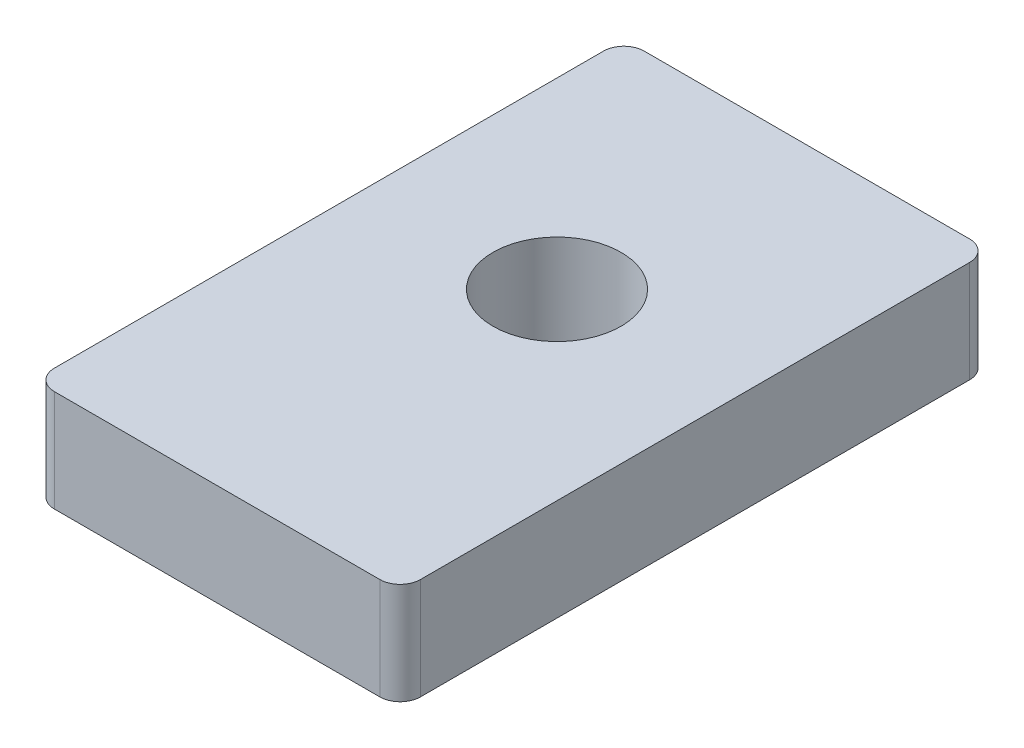
ISO-10303-21;
HEADER;
FILE_DESCRIPTION(('STEP AP214'),'2;1');
FILE_NAME('part.step','',(''),(''),'','','');
FILE_SCHEMA(('AUTOMOTIVE_DESIGN { 1 0 10303 214 1 1 1 1 }'));
ENDSEC;
DATA;
#1=APPLICATION_CONTEXT('core data for automotive mechanical design processes');
#2=APPLICATION_PROTOCOL_DEFINITION('international standard','automotive_design',2000,#1);
#3=PRODUCT_CONTEXT('',#1,'mechanical');
#4=PRODUCT('Part','Part','',(#3));
#5=PRODUCT_RELATED_PRODUCT_CATEGORY('part','',(#4));
#6=PRODUCT_DEFINITION_FORMATION('','',#4);
#7=PRODUCT_DEFINITION_CONTEXT('part definition',#1,'design');
#8=PRODUCT_DEFINITION('design','',#6,#7);
#9=PRODUCT_DEFINITION_SHAPE('','',#8);
#10=(LENGTH_UNIT() NAMED_UNIT(*) SI_UNIT(.MILLI.,.METRE.));
#11=(NAMED_UNIT(*) PLANE_ANGLE_UNIT() SI_UNIT($,.RADIAN.));
#12=(NAMED_UNIT(*) SI_UNIT($,.STERADIAN.) SOLID_ANGLE_UNIT());
#13=UNCERTAINTY_MEASURE_WITH_UNIT(LENGTH_MEASURE(1.E-05),#10,'distance_accuracy_value','');
#14=(GEOMETRIC_REPRESENTATION_CONTEXT(3) GLOBAL_UNCERTAINTY_ASSIGNED_CONTEXT((#13)) GLOBAL_UNIT_ASSIGNED_CONTEXT((#10,
#11,#12)) REPRESENTATION_CONTEXT('',''));
#15=CARTESIAN_POINT('',(0.,0.,0.));
#16=DIRECTION('',(0.,0.,1.));
#17=DIRECTION('',(1.,0.,0.));
#18=AXIS2_PLACEMENT_3D('',#15,#16,#17);
#19=CARTESIAN_POINT('',(0.,10.,58.));
#20=DIRECTION('',(1.,0.,0.));
#21=DIRECTION('',(0.,0.,-1.));
#22=AXIS2_PLACEMENT_3D('',#19,#20,#21);
#23=PLANE('',#22);
#24=DIRECTION('',(0.,0.,-1.));
#25=VECTOR('',#24,1.);
#26=CARTESIAN_POINT('',(0.,10.,58.));
#27=LINE('',#26,#25);
#28=CARTESIAN_POINT('',(0.,10.,56.));
#29=VERTEX_POINT('',#28);
#30=CARTESIAN_POINT('',(0.,10.,2.00000000000002));
#31=VERTEX_POINT('',#30);
#32=EDGE_CURVE('E160',#29,#31,#27,.T.);
#33=ORIENTED_EDGE('',*,*,#32,.T.);
#34=DIRECTION('',(0.,-1.,0.));
#35=VECTOR('',#34,1.);
#36=CARTESIAN_POINT('',(0.,10.,2.));
#37=LINE('',#36,#35);
#38=CARTESIAN_POINT('',(0.,0.,2.00000000000002));
#39=VERTEX_POINT('',#38);
#40=EDGE_CURVE('E124',#31,#39,#37,.T.);
#41=ORIENTED_EDGE('',*,*,#40,.T.);
#42=DIRECTION('',(0.,0.,-1.));
#43=VECTOR('',#42,1.);
#44=CARTESIAN_POINT('',(0.,0.,58.));
#45=LINE('',#44,#43);
#46=CARTESIAN_POINT('',(0.,0.,56.));
#47=VERTEX_POINT('',#46);
#48=EDGE_CURVE('E109',#47,#39,#45,.T.);
#49=ORIENTED_EDGE('',*,*,#48,.F.);
#50=DIRECTION('',(0.,-1.,0.));
#51=VECTOR('',#50,1.);
#52=CARTESIAN_POINT('',(0.,10.,56.));
#53=LINE('',#52,#51);
#54=EDGE_CURVE('E121',#47,#29,#53,.F.);
#55=ORIENTED_EDGE('',*,*,#54,.T.);
#56=EDGE_LOOP('',(#33,#41,#49,#55));
#57=FACE_BOUND('',#56,.T.);
#58=ADVANCED_FACE('F39',(#57),#23,.F.);
#59=CARTESIAN_POINT('',(0.,0.,58.));
#60=DIRECTION('',(0.,1.,0.));
#61=DIRECTION('',(0.,0.,1.));
#62=AXIS2_PLACEMENT_3D('',#59,#60,#61);
#63=PLANE('',#62);
#64=CARTESIAN_POINT('',(18.,0.,24.5744));
#65=DIRECTION('',(0.,1.,0.));
#66=DIRECTION('',(0.,0.,1.));
#67=AXIS2_PLACEMENT_3D('',#64,#65,#66);
#68=CIRCLE('',#67,6.3);
#69=CARTESIAN_POINT('',(18.,0.,30.8744));
#70=VERTEX_POINT('',#69);
#71=EDGE_CURVE('E171',#70,#70,#68,.T.);
#72=ORIENTED_EDGE('',*,*,#71,.T.);
#73=EDGE_LOOP('',(#72));
#74=FACE_BOUND('',#73,.T.);
#75=ORIENTED_EDGE('',*,*,#48,.T.);
#76=CARTESIAN_POINT('',(2.,0.,2.));
#77=DIRECTION('',(0.,1.,0.));
#78=DIRECTION('',(0.,0.,1.));
#79=AXIS2_PLACEMENT_3D('',#76,#77,#78);
#80=CIRCLE('',#79,2.);
#81=CARTESIAN_POINT('',(2.,0.,0.));
#82=VERTEX_POINT('',#81);
#83=EDGE_CURVE('E136',#39,#82,#80,.F.);
#84=ORIENTED_EDGE('',*,*,#83,.T.);
#85=DIRECTION('',(1.,0.,0.));
#86=VECTOR('',#85,1.);
#87=CARTESIAN_POINT('',(0.,0.,0.));
#88=LINE('',#87,#86);
#89=CARTESIAN_POINT('',(34.,0.,0.));
#90=VERTEX_POINT('',#89);
#91=EDGE_CURVE('E168',#82,#90,#88,.T.);
#92=ORIENTED_EDGE('',*,*,#91,.T.);
#93=CARTESIAN_POINT('',(34.,0.,2.));
#94=DIRECTION('',(0.,1.,0.));
#95=DIRECTION('',(0.,0.,1.));
#96=AXIS2_PLACEMENT_3D('',#93,#94,#95);
#97=CIRCLE('',#96,2.);
#98=CARTESIAN_POINT('',(36.,0.,2.00000000000002));
#99=VERTEX_POINT('',#98);
#100=EDGE_CURVE('E115',#90,#99,#97,.F.);
#101=ORIENTED_EDGE('',*,*,#100,.T.);
#102=DIRECTION('',(0.,0.,-1.));
#103=VECTOR('',#102,1.);
#104=CARTESIAN_POINT('',(36.,0.,58.));
#105=LINE('',#104,#103);
#106=CARTESIAN_POINT('',(36.,0.,56.));
#107=VERTEX_POINT('',#106);
#108=EDGE_CURVE('E125',#107,#99,#105,.T.);
#109=ORIENTED_EDGE('',*,*,#108,.F.);
#110=CARTESIAN_POINT('',(34.,0.,56.));
#111=DIRECTION('',(0.,1.,0.));
#112=DIRECTION('',(0.,0.,1.));
#113=AXIS2_PLACEMENT_3D('',#110,#111,#112);
#114=CIRCLE('',#113,2.);
#115=CARTESIAN_POINT('',(34.,0.,58.));
#116=VERTEX_POINT('',#115);
#117=EDGE_CURVE('E116',#107,#116,#114,.F.);
#118=ORIENTED_EDGE('',*,*,#117,.T.);
#119=DIRECTION('',(1.,0.,0.));
#120=VECTOR('',#119,1.);
#121=CARTESIAN_POINT('',(0.,0.,58.));
#122=LINE('',#121,#120);
#123=CARTESIAN_POINT('',(2.,0.,58.));
#124=VERTEX_POINT('',#123);
#125=EDGE_CURVE('E111',#124,#116,#122,.T.);
#126=ORIENTED_EDGE('',*,*,#125,.F.);
#127=CARTESIAN_POINT('',(2.,0.,56.));
#128=DIRECTION('',(0.,1.,0.));
#129=DIRECTION('',(0.,0.,1.));
#130=AXIS2_PLACEMENT_3D('',#127,#128,#129);
#131=CIRCLE('',#130,2.);
#132=EDGE_CURVE('E106',#124,#47,#131,.F.);
#133=ORIENTED_EDGE('',*,*,#132,.T.);
#134=EDGE_LOOP('',(#75,#84,#92,#101,#109,#118,#126,#133));
#135=FACE_BOUND('',#134,.T.);
#136=ADVANCED_FACE('F108',(#74,#135),#63,.F.);
#137=CARTESIAN_POINT('',(36.,0.,58.));
#138=DIRECTION('',(-1.,0.,0.));
#139=DIRECTION('',(0.,0.,1.));
#140=AXIS2_PLACEMENT_3D('',#137,#138,#139);
#141=PLANE('',#140);
#142=ORIENTED_EDGE('',*,*,#108,.T.);
#143=DIRECTION('',(0.,1.,0.));
#144=VECTOR('',#143,1.);
#145=CARTESIAN_POINT('',(36.,0.,2.));
#146=LINE('',#145,#144);
#147=CARTESIAN_POINT('',(36.,10.,2.00000000000002));
#148=VERTEX_POINT('',#147);
#149=EDGE_CURVE('E149',#99,#148,#146,.T.);
#150=ORIENTED_EDGE('',*,*,#149,.T.);
#151=DIRECTION('',(0.,0.,-1.));
#152=VECTOR('',#151,1.);
#153=CARTESIAN_POINT('',(36.,10.,58.));
#154=LINE('',#153,#152);
#155=CARTESIAN_POINT('',(36.,10.,56.));
#156=VERTEX_POINT('',#155);
#157=EDGE_CURVE('E162',#156,#148,#154,.T.);
#158=ORIENTED_EDGE('',*,*,#157,.F.);
#159=DIRECTION('',(0.,1.,0.));
#160=VECTOR('',#159,1.);
#161=CARTESIAN_POINT('',(36.,0.,56.));
#162=LINE('',#161,#160);
#163=EDGE_CURVE('E147',#156,#107,#162,.F.);
#164=ORIENTED_EDGE('',*,*,#163,.T.);
#165=EDGE_LOOP('',(#142,#150,#158,#164));
#166=FACE_BOUND('',#165,.T.);
#167=ADVANCED_FACE('F176',(#166),#141,.F.);
#168=CARTESIAN_POINT('',(36.,10.,58.));
#169=DIRECTION('',(0.,-1.,0.));
#170=DIRECTION('',(0.,0.,-1.));
#171=AXIS2_PLACEMENT_3D('',#168,#169,#170);
#172=PLANE('',#171);
#173=CARTESIAN_POINT('',(18.,10.,24.5744));
#174=DIRECTION('',(0.,1.,0.));
#175=DIRECTION('',(0.,0.,1.));
#176=AXIS2_PLACEMENT_3D('',#173,#174,#175);
#177=CIRCLE('',#176,6.3);
#178=CARTESIAN_POINT('',(18.,10.,30.8744));
#179=VERTEX_POINT('',#178);
#180=EDGE_CURVE('E302',#179,#179,#177,.T.);
#181=ORIENTED_EDGE('',*,*,#180,.F.);
#182=EDGE_LOOP('',(#181));
#183=FACE_BOUND('',#182,.T.);
#184=DIRECTION('',(-1.,0.,0.));
#185=VECTOR('',#184,1.);
#186=CARTESIAN_POINT('',(36.,10.,0.));
#187=LINE('',#186,#185);
#188=CARTESIAN_POINT('',(34.,10.,0.));
#189=VERTEX_POINT('',#188);
#190=CARTESIAN_POINT('',(2.,10.,0.));
#191=VERTEX_POINT('',#190);
#192=EDGE_CURVE('E164',#189,#191,#187,.T.);
#193=ORIENTED_EDGE('',*,*,#192,.T.);
#194=CARTESIAN_POINT('',(2.,10.,2.));
#195=DIRECTION('',(0.,-1.,0.));
#196=DIRECTION('',(0.,0.,-1.));
#197=AXIS2_PLACEMENT_3D('',#194,#195,#196);
#198=CIRCLE('',#197,2.);
#199=EDGE_CURVE('E145',#191,#31,#198,.F.);
#200=ORIENTED_EDGE('',*,*,#199,.T.);
#201=ORIENTED_EDGE('',*,*,#32,.F.);
#202=CARTESIAN_POINT('',(2.,10.,56.));
#203=DIRECTION('',(0.,-1.,0.));
#204=DIRECTION('',(0.,0.,-1.));
#205=AXIS2_PLACEMENT_3D('',#202,#203,#204);
#206=CIRCLE('',#205,2.);
#207=CARTESIAN_POINT('',(2.,10.,58.));
#208=VERTEX_POINT('',#207);
#209=EDGE_CURVE('E129',#29,#208,#206,.F.);
#210=ORIENTED_EDGE('',*,*,#209,.T.);
#211=DIRECTION('',(-1.,0.,0.));
#212=VECTOR('',#211,1.);
#213=CARTESIAN_POINT('',(36.,10.,58.));
#214=LINE('',#213,#212);
#215=CARTESIAN_POINT('',(34.,10.,58.));
#216=VERTEX_POINT('',#215);
#217=EDGE_CURVE('E155',#216,#208,#214,.T.);
#218=ORIENTED_EDGE('',*,*,#217,.F.);
#219=CARTESIAN_POINT('',(34.,10.,56.));
#220=DIRECTION('',(0.,-1.,0.));
#221=DIRECTION('',(0.,0.,-1.));
#222=AXIS2_PLACEMENT_3D('',#219,#220,#221);
#223=CIRCLE('',#222,2.);
#224=EDGE_CURVE('E62',#216,#156,#223,.F.);
#225=ORIENTED_EDGE('',*,*,#224,.T.);
#226=ORIENTED_EDGE('',*,*,#157,.T.);
#227=CARTESIAN_POINT('',(34.,10.,2.));
#228=DIRECTION('',(0.,-1.,0.));
#229=DIRECTION('',(0.,0.,-1.));
#230=AXIS2_PLACEMENT_3D('',#227,#228,#229);
#231=CIRCLE('',#230,2.);
#232=EDGE_CURVE('E54',#148,#189,#231,.F.);
#233=ORIENTED_EDGE('',*,*,#232,.T.);
#234=EDGE_LOOP('',(#193,#200,#201,#210,#218,#225,#226,#233));
#235=FACE_BOUND('',#234,.T.);
#236=ADVANCED_FACE('F159',(#183,#235),#172,.F.);
#237=CARTESIAN_POINT('',(0.,0.,58.));
#238=DIRECTION('',(0.,0.,1.));
#239=DIRECTION('',(1.,0.,0.));
#240=AXIS2_PLACEMENT_3D('',#237,#238,#239);
#241=PLANE('',#240);
#242=ORIENTED_EDGE('',*,*,#217,.T.);
#243=DIRECTION('',(0.,-1.,0.));
#244=VECTOR('',#243,1.);
#245=CARTESIAN_POINT('',(2.,0.,58.));
#246=LINE('',#245,#244);
#247=EDGE_CURVE('E11',#208,#124,#246,.T.);
#248=ORIENTED_EDGE('',*,*,#247,.T.);
#249=ORIENTED_EDGE('',*,*,#125,.T.);
#250=DIRECTION('',(0.,1.,0.));
#251=VECTOR('',#250,1.);
#252=CARTESIAN_POINT('',(34.,10.,58.));
#253=LINE('',#252,#251);
#254=EDGE_CURVE('E47',#116,#216,#253,.T.);
#255=ORIENTED_EDGE('',*,*,#254,.T.);
#256=EDGE_LOOP('',(#242,#248,#249,#255));
#257=FACE_BOUND('',#256,.T.);
#258=ADVANCED_FACE('F154',(#257),#241,.T.);
#259=CARTESIAN_POINT('',(0.,0.,0.));
#260=DIRECTION('',(0.,0.,1.));
#261=DIRECTION('',(1.,0.,0.));
#262=AXIS2_PLACEMENT_3D('',#259,#260,#261);
#263=PLANE('',#262);
#264=ORIENTED_EDGE('',*,*,#91,.F.);
#265=DIRECTION('',(0.,-1.,0.));
#266=VECTOR('',#265,1.);
#267=CARTESIAN_POINT('',(2.,0.,0.));
#268=LINE('',#267,#266);
#269=EDGE_CURVE('E140',#82,#191,#268,.F.);
#270=ORIENTED_EDGE('',*,*,#269,.T.);
#271=ORIENTED_EDGE('',*,*,#192,.F.);
#272=DIRECTION('',(0.,1.,0.));
#273=VECTOR('',#272,1.);
#274=CARTESIAN_POINT('',(34.,0.,0.));
#275=LINE('',#274,#273);
#276=EDGE_CURVE('E138',#189,#90,#275,.F.);
#277=ORIENTED_EDGE('',*,*,#276,.T.);
#278=EDGE_LOOP('',(#264,#270,#271,#277));
#279=FACE_BOUND('',#278,.T.);
#280=ADVANCED_FACE('F183',(#279),#263,.F.);
#281=CARTESIAN_POINT('',(2.,10.,2.));
#282=DIRECTION('',(0.,-1.,0.));
#283=DIRECTION('',(0.,0.,-1.));
#284=AXIS2_PLACEMENT_3D('',#281,#282,#283);
#285=CYLINDRICAL_SURFACE('',#284,2.);
#286=ORIENTED_EDGE('',*,*,#199,.F.);
#287=ORIENTED_EDGE('',*,*,#269,.F.);
#288=ORIENTED_EDGE('',*,*,#83,.F.);
#289=ORIENTED_EDGE('',*,*,#40,.F.);
#290=EDGE_LOOP('',(#286,#287,#288,#289));
#291=FACE_BOUND('',#290,.T.);
#292=ADVANCED_FACE('F187',(#291),#285,.T.);
#293=CARTESIAN_POINT('',(34.,0.,2.));
#294=DIRECTION('',(0.,1.,0.));
#295=DIRECTION('',(0.,0.,1.));
#296=AXIS2_PLACEMENT_3D('',#293,#294,#295);
#297=CYLINDRICAL_SURFACE('',#296,2.);
#298=ORIENTED_EDGE('',*,*,#100,.F.);
#299=ORIENTED_EDGE('',*,*,#276,.F.);
#300=ORIENTED_EDGE('',*,*,#232,.F.);
#301=ORIENTED_EDGE('',*,*,#149,.F.);
#302=EDGE_LOOP('',(#298,#299,#300,#301));
#303=FACE_BOUND('',#302,.T.);
#304=ADVANCED_FACE('F179',(#303),#297,.T.);
#305=CARTESIAN_POINT('',(2.,0.,56.));
#306=DIRECTION('',(0.,1.,0.));
#307=DIRECTION('',(0.,0.,1.));
#308=AXIS2_PLACEMENT_3D('',#305,#306,#307);
#309=CYLINDRICAL_SURFACE('',#308,2.);
#310=ORIENTED_EDGE('',*,*,#209,.F.);
#311=ORIENTED_EDGE('',*,*,#54,.F.);
#312=ORIENTED_EDGE('',*,*,#132,.F.);
#313=ORIENTED_EDGE('',*,*,#247,.F.);
#314=EDGE_LOOP('',(#310,#311,#312,#313));
#315=FACE_BOUND('',#314,.T.);
#316=ADVANCED_FACE('F128',(#315),#309,.T.);
#317=CARTESIAN_POINT('',(34.,0.,56.));
#318=DIRECTION('',(0.,-1.,0.));
#319=DIRECTION('',(0.,0.,-1.));
#320=AXIS2_PLACEMENT_3D('',#317,#318,#319);
#321=CYLINDRICAL_SURFACE('',#320,2.);
#322=ORIENTED_EDGE('',*,*,#117,.F.);
#323=ORIENTED_EDGE('',*,*,#163,.F.);
#324=ORIENTED_EDGE('',*,*,#224,.F.);
#325=ORIENTED_EDGE('',*,*,#254,.F.);
#326=EDGE_LOOP('',(#322,#323,#324,#325));
#327=FACE_BOUND('',#326,.T.);
#328=ADVANCED_FACE('F41',(#327),#321,.T.);
#329=CARTESIAN_POINT('',(18.,0.,24.5744));
#330=DIRECTION('',(0.,1.,0.));
#331=DIRECTION('',(0.,0.,1.));
#332=AXIS2_PLACEMENT_3D('',#329,#330,#331);
#333=CYLINDRICAL_SURFACE('',#332,6.3);
#334=ORIENTED_EDGE('',*,*,#71,.F.);
#335=EDGE_LOOP('',(#334));
#336=FACE_BOUND('',#335,.T.);
#337=ORIENTED_EDGE('',*,*,#180,.T.);
#338=EDGE_LOOP('',(#337));
#339=FACE_BOUND('',#338,.T.);
#340=ADVANCED_FACE('F189',(#336,#339),#333,.F.);
#341=CLOSED_SHELL('',(#58,#136,#167,#236,#258,#280,#292,#304,#316,#328,#340));
#342=MANIFOLD_SOLID_BREP('B2',#341);
#343=ADVANCED_BREP_SHAPE_REPRESENTATION('',(#18,#342),#14);
#344=SHAPE_DEFINITION_REPRESENTATION(#9,#343);
ENDSEC;
END-ISO-10303-21;
